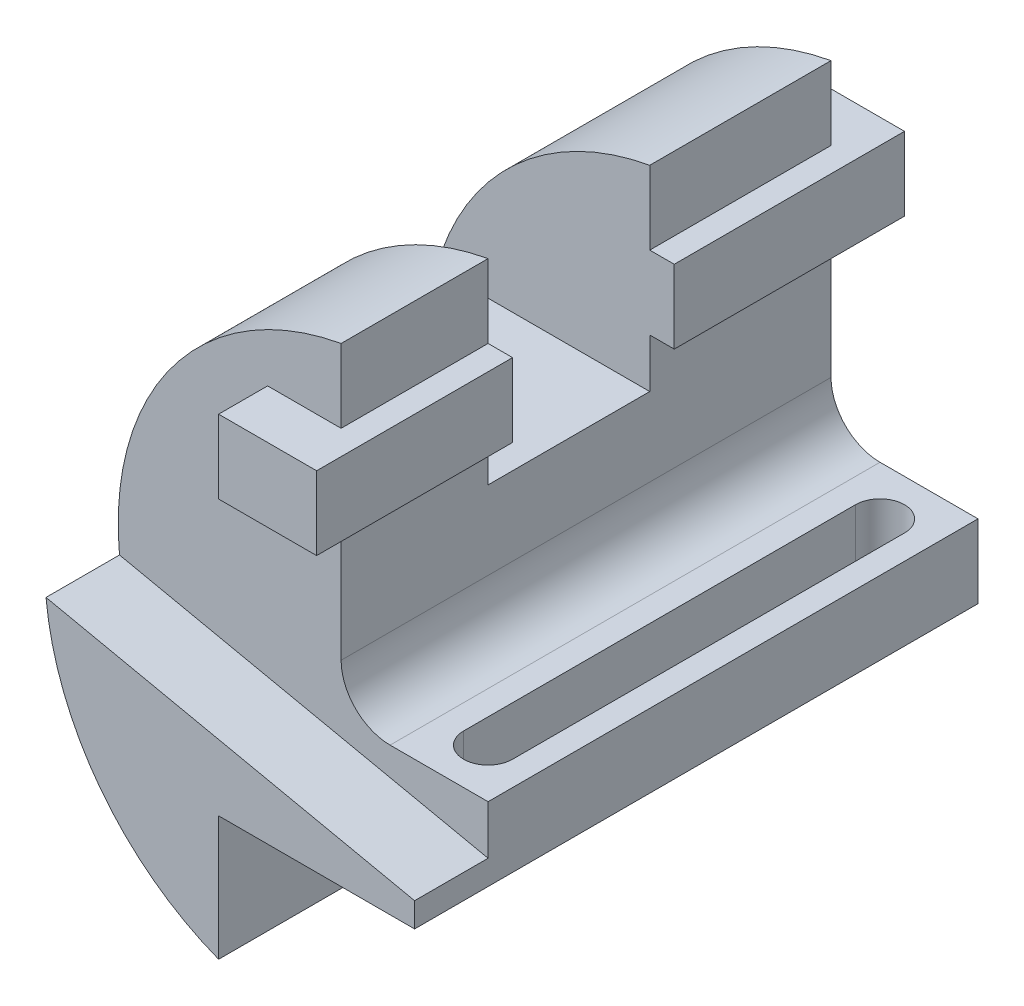
ISO-10303-21;
HEADER;
FILE_DESCRIPTION(('STEP AP214'),'2;1');
FILE_NAME('part.step','',(''),(''),'','','');
FILE_SCHEMA(('AUTOMOTIVE_DESIGN { 1 0 10303 214 1 1 1 1 }'));
ENDSEC;
DATA;
#1=APPLICATION_CONTEXT('core data for automotive mechanical design processes');
#2=APPLICATION_PROTOCOL_DEFINITION('international standard','automotive_design',2000,#1);
#3=PRODUCT_CONTEXT('',#1,'mechanical');
#4=PRODUCT('Part','Part','',(#3));
#5=PRODUCT_RELATED_PRODUCT_CATEGORY('part','',(#4));
#6=PRODUCT_DEFINITION_FORMATION('','',#4);
#7=PRODUCT_DEFINITION_CONTEXT('part definition',#1,'design');
#8=PRODUCT_DEFINITION('design','',#6,#7);
#9=PRODUCT_DEFINITION_SHAPE('','',#8);
#10=(LENGTH_UNIT() NAMED_UNIT(*) SI_UNIT(.MILLI.,.METRE.));
#11=(NAMED_UNIT(*) PLANE_ANGLE_UNIT() SI_UNIT($,.RADIAN.));
#12=(NAMED_UNIT(*) SI_UNIT($,.STERADIAN.) SOLID_ANGLE_UNIT());
#13=UNCERTAINTY_MEASURE_WITH_UNIT(LENGTH_MEASURE(1.E-05),#10,'distance_accuracy_value','');
#14=(GEOMETRIC_REPRESENTATION_CONTEXT(3) GLOBAL_UNCERTAINTY_ASSIGNED_CONTEXT((#13)) GLOBAL_UNIT_ASSIGNED_CONTEXT((#10,
#11,#12)) REPRESENTATION_CONTEXT('',''));
#15=CARTESIAN_POINT('',(0.,0.,0.));
#16=DIRECTION('',(0.,0.,1.));
#17=DIRECTION('',(1.,0.,0.));
#18=AXIS2_PLACEMENT_3D('',#15,#16,#17);
#19=CARTESIAN_POINT('',(-30.,15.,115.));
#20=DIRECTION('',(-1.,0.,0.));
#21=DIRECTION('',(0.,0.,1.));
#22=AXIS2_PLACEMENT_3D('',#19,#20,#21);
#23=PLANE('',#22);
#24=DIRECTION('',(0.,0.,1.));
#25=VECTOR('',#24,1.);
#26=CARTESIAN_POINT('',(-30.,66.,115.));
#27=LINE('',#26,#25);
#28=CARTESIAN_POINT('',(-30.,66.,70.));
#29=VERTEX_POINT('',#28);
#30=CARTESIAN_POINT('',(-30.,66.,100.));
#31=VERTEX_POINT('',#30);
#32=EDGE_CURVE('E370',#29,#31,#27,.T.);
#33=ORIENTED_EDGE('',*,*,#32,.F.);
#34=DIRECTION('',(0.,1.,0.));
#35=VECTOR('',#34,1.);
#36=CARTESIAN_POINT('',(-30.,15.,70.));
#37=LINE('',#36,#35);
#38=CARTESIAN_POINT('',(-30.0000000000001,81.,70.));
#39=VERTEX_POINT('',#38);
#40=EDGE_CURVE('E301',#29,#39,#37,.T.);
#41=ORIENTED_EDGE('',*,*,#40,.T.);
#42=DIRECTION('',(0.,0.,-1.));
#43=VECTOR('',#42,1.);
#44=CARTESIAN_POINT('',(-30.,81.,115.));
#45=LINE('',#44,#43);
#46=CARTESIAN_POINT('',(-30.,81.,100.));
#47=VERTEX_POINT('',#46);
#48=EDGE_CURVE('E465',#47,#39,#45,.T.);
#49=ORIENTED_EDGE('',*,*,#48,.F.);
#50=DIRECTION('',(0.,1.,0.));
#51=VECTOR('',#50,1.);
#52=CARTESIAN_POINT('',(-30.,15.,100.));
#53=LINE('',#52,#51);
#54=EDGE_CURVE('E399',#31,#47,#53,.T.);
#55=ORIENTED_EDGE('',*,*,#54,.F.);
#56=EDGE_LOOP('',(#33,#41,#49,#55));
#57=FACE_BOUND('',#56,.T.);
#58=ADVANCED_FACE('F47',(#57),#23,.F.);
#59=CARTESIAN_POINT('',(-25.,66.,-10.));
#60=DIRECTION('',(-1.,0.,0.));
#61=DIRECTION('',(0.,-1.,0.));
#62=AXIS2_PLACEMENT_3D('',#59,#60,#61);
#63=PLANE('',#62);
#64=DIRECTION('',(0.,0.,1.));
#65=VECTOR('',#64,1.);
#66=CARTESIAN_POINT('',(-25.,51.,-10.));
#67=LINE('',#66,#65);
#68=CARTESIAN_POINT('',(-25.,51.,70.));
#69=VERTEX_POINT('',#68);
#70=CARTESIAN_POINT('',(-25.,51.,110.));
#71=VERTEX_POINT('',#70);
#72=EDGE_CURVE('E365',#69,#71,#67,.T.);
#73=ORIENTED_EDGE('',*,*,#72,.F.);
#74=DIRECTION('',(0.,1.,0.));
#75=VECTOR('',#74,1.);
#76=CARTESIAN_POINT('',(-25.,66.,70.));
#77=LINE('',#76,#75);
#78=CARTESIAN_POINT('',(-25.,66.,70.));
#79=VERTEX_POINT('',#78);
#80=EDGE_CURVE('E297',#69,#79,#77,.T.);
#81=ORIENTED_EDGE('',*,*,#80,.T.);
#82=DIRECTION('',(0.,0.,1.));
#83=VECTOR('',#82,1.);
#84=CARTESIAN_POINT('',(-25.,66.,-10.));
#85=LINE('',#84,#83);
#86=CARTESIAN_POINT('',(-25.,66.,110.));
#87=VERTEX_POINT('',#86);
#88=EDGE_CURVE('E350',#79,#87,#85,.T.);
#89=ORIENTED_EDGE('',*,*,#88,.T.);
#90=DIRECTION('',(0.,1.,0.));
#91=VECTOR('',#90,1.);
#92=CARTESIAN_POINT('',(-25.,66.,110.));
#93=LINE('',#92,#91);
#94=EDGE_CURVE('E329',#71,#87,#93,.T.);
#95=ORIENTED_EDGE('',*,*,#94,.F.);
#96=EDGE_LOOP('',(#73,#81,#89,#95));
#97=FACE_BOUND('',#96,.T.);
#98=ADVANCED_FACE('F530',(#97),#63,.F.);
#99=CARTESIAN_POINT('',(-25.,51.,-10.));
#100=DIRECTION('',(0.,1.,0.));
#101=DIRECTION('',(0.,0.,1.));
#102=AXIS2_PLACEMENT_3D('',#99,#100,#101);
#103=PLANE('',#102);
#104=DIRECTION('',(0.,0.,-1.));
#105=VECTOR('',#104,1.);
#106=CARTESIAN_POINT('',(-30.,51.,115.));
#107=LINE('',#106,#105);
#108=CARTESIAN_POINT('',(-30.,51.,100.));
#109=VERTEX_POINT('',#108);
#110=CARTESIAN_POINT('',(-30.,51.,70.));
#111=VERTEX_POINT('',#110);
#112=EDGE_CURVE('E384',#109,#111,#107,.T.);
#113=ORIENTED_EDGE('',*,*,#112,.T.);
#114=DIRECTION('',(1.,0.,0.));
#115=VECTOR('',#114,1.);
#116=CARTESIAN_POINT('',(-25.,51.,70.));
#117=LINE('',#116,#115);
#118=EDGE_CURVE('E305',#111,#69,#117,.T.);
#119=ORIENTED_EDGE('',*,*,#118,.T.);
#120=ORIENTED_EDGE('',*,*,#72,.T.);
#121=DIRECTION('',(1.,0.,0.));
#122=VECTOR('',#121,1.);
#123=CARTESIAN_POINT('',(-25.,51.,110.));
#124=LINE('',#123,#122);
#125=CARTESIAN_POINT('',(-45.,51.,110.));
#126=VERTEX_POINT('',#125);
#127=EDGE_CURVE('E333',#126,#71,#124,.T.);
#128=ORIENTED_EDGE('',*,*,#127,.F.);
#129=DIRECTION('',(0.,0.,1.));
#130=VECTOR('',#129,1.);
#131=CARTESIAN_POINT('',(-45.,51.,-10.));
#132=LINE('',#131,#130);
#133=CARTESIAN_POINT('',(-45.,51.,100.));
#134=VERTEX_POINT('',#133);
#135=EDGE_CURVE('E360',#134,#126,#132,.T.);
#136=ORIENTED_EDGE('',*,*,#135,.F.);
#137=DIRECTION('',(-1.,0.,0.));
#138=VECTOR('',#137,1.);
#139=CARTESIAN_POINT('',(-20.,51.,100.));
#140=LINE('',#139,#138);
#141=EDGE_CURVE('E480',#109,#134,#140,.T.);
#142=ORIENTED_EDGE('',*,*,#141,.F.);
#143=EDGE_LOOP('',(#113,#119,#120,#128,#136,#142));
#144=FACE_BOUND('',#143,.T.);
#145=ADVANCED_FACE('F549',(#144),#103,.F.);
#146=CARTESIAN_POINT('',(-25.,66.,-10.));
#147=DIRECTION('',(0.,-1.,0.));
#148=DIRECTION('',(0.,0.,-1.));
#149=AXIS2_PLACEMENT_3D('',#146,#147,#148);
#150=PLANE('',#149);
#151=ORIENTED_EDGE('',*,*,#88,.F.);
#152=DIRECTION('',(-1.,0.,0.));
#153=VECTOR('',#152,1.);
#154=CARTESIAN_POINT('',(-25.,66.,70.));
#155=LINE('',#154,#153);
#156=EDGE_CURVE('E488',#79,#29,#155,.T.);
#157=ORIENTED_EDGE('',*,*,#156,.T.);
#158=ORIENTED_EDGE('',*,*,#32,.T.);
#159=DIRECTION('',(1.,0.,0.));
#160=VECTOR('',#159,1.);
#161=CARTESIAN_POINT('',(-20.,66.,100.));
#162=LINE('',#161,#160);
#163=CARTESIAN_POINT('',(-45.,66.,100.));
#164=VERTEX_POINT('',#163);
#165=EDGE_CURVE('E472',#164,#31,#162,.T.);
#166=ORIENTED_EDGE('',*,*,#165,.F.);
#167=DIRECTION('',(0.,0.,1.));
#168=VECTOR('',#167,1.);
#169=CARTESIAN_POINT('',(-45.,66.,-10.));
#170=LINE('',#169,#168);
#171=CARTESIAN_POINT('',(-45.,66.,110.));
#172=VERTEX_POINT('',#171);
#173=EDGE_CURVE('E355',#164,#172,#170,.T.);
#174=ORIENTED_EDGE('',*,*,#173,.T.);
#175=DIRECTION('',(-1.,0.,0.));
#176=VECTOR('',#175,1.);
#177=CARTESIAN_POINT('',(-25.,66.,110.));
#178=LINE('',#177,#176);
#179=EDGE_CURVE('E325',#87,#172,#178,.T.);
#180=ORIENTED_EDGE('',*,*,#179,.F.);
#181=EDGE_LOOP('',(#151,#157,#158,#166,#174,#180));
#182=FACE_BOUND('',#181,.T.);
#183=ADVANCED_FACE('F537',(#182),#150,.F.);
#184=CARTESIAN_POINT('',(-30.,25.,100.));
#185=VERTEX_POINT('',#184);
#186=EDGE_CURVE('E400',#185,#109,#53,.T.);
#187=ORIENTED_EDGE('',*,*,#186,.F.);
#188=DIRECTION('',(0.,0.,-1.));
#189=VECTOR('',#188,1.);
#190=CARTESIAN_POINT('',(-30.,25.,0.));
#191=LINE('',#190,#189);
#192=CARTESIAN_POINT('',(-30.,25.,0.));
#193=VERTEX_POINT('',#192);
#194=EDGE_CURVE('E509',#185,#193,#191,.T.);
#195=ORIENTED_EDGE('',*,*,#194,.T.);
#196=DIRECTION('',(0.,1.,0.));
#197=VECTOR('',#196,1.);
#198=CARTESIAN_POINT('',(-30.,15.,0.));
#199=LINE('',#198,#197);
#200=CARTESIAN_POINT('',(-30.,51.,0.));
#201=VERTEX_POINT('',#200);
#202=EDGE_CURVE('E442',#193,#201,#199,.T.);
#203=ORIENTED_EDGE('',*,*,#202,.T.);
#204=CARTESIAN_POINT('',(-30.,51.,37.));
#205=VERTEX_POINT('',#204);
#206=EDGE_CURVE('E383',#205,#201,#107,.T.);
#207=ORIENTED_EDGE('',*,*,#206,.F.);
#208=DIRECTION('',(0.,-1.,0.));
#209=VECTOR('',#208,1.);
#210=CARTESIAN_POINT('',(-30.,15.,37.));
#211=LINE('',#210,#209);
#212=CARTESIAN_POINT('',(-30.,41.,37.));
#213=VERTEX_POINT('',#212);
#214=EDGE_CURVE('E293',#205,#213,#211,.T.);
#215=ORIENTED_EDGE('',*,*,#214,.T.);
#216=DIRECTION('',(0.,0.,1.));
#217=VECTOR('',#216,1.);
#218=CARTESIAN_POINT('',(-30.,41.,115.));
#219=LINE('',#218,#217);
#220=CARTESIAN_POINT('',(-30.,41.,70.));
#221=VERTEX_POINT('',#220);
#222=EDGE_CURVE('E317',#213,#221,#219,.T.);
#223=ORIENTED_EDGE('',*,*,#222,.T.);
#224=DIRECTION('',(0.,1.,0.));
#225=VECTOR('',#224,1.);
#226=CARTESIAN_POINT('',(-30.,15.,70.));
#227=LINE('',#226,#225);
#228=EDGE_CURVE('E313',#221,#111,#227,.T.);
#229=ORIENTED_EDGE('',*,*,#228,.T.);
#230=ORIENTED_EDGE('',*,*,#112,.F.);
#231=EDGE_LOOP('',(#187,#195,#203,#207,#215,#223,#229,#230));
#232=FACE_BOUND('',#231,.T.);
#233=ADVANCED_FACE('F551',(#232),#23,.F.);
#234=CARTESIAN_POINT('',(-30.0000000000001,81.,37.));
#235=VERTEX_POINT('',#234);
#236=CARTESIAN_POINT('',(-30.,81.,0.));
#237=VERTEX_POINT('',#236);
#238=EDGE_CURVE('E464',#235,#237,#45,.T.);
#239=ORIENTED_EDGE('',*,*,#238,.F.);
#240=DIRECTION('',(0.,-1.,0.));
#241=VECTOR('',#240,1.);
#242=CARTESIAN_POINT('',(-30.,15.,37.));
#243=LINE('',#242,#241);
#244=CARTESIAN_POINT('',(-30.,66.,37.));
#245=VERTEX_POINT('',#244);
#246=EDGE_CURVE('E281',#235,#245,#243,.T.);
#247=ORIENTED_EDGE('',*,*,#246,.T.);
#248=CARTESIAN_POINT('',(-30.,66.,0.));
#249=VERTEX_POINT('',#248);
#250=EDGE_CURVE('E371',#249,#245,#27,.T.);
#251=ORIENTED_EDGE('',*,*,#250,.F.);
#252=EDGE_CURVE('E441',#249,#237,#199,.T.);
#253=ORIENTED_EDGE('',*,*,#252,.T.);
#254=EDGE_LOOP('',(#239,#247,#251,#253));
#255=FACE_BOUND('',#254,.T.);
#256=ADVANCED_FACE('F611',(#255),#23,.F.);
#257=CARTESIAN_POINT('',(-20.,26.4083339693685,0.));
#258=DIRECTION('',(0.,0.,-1.));
#259=DIRECTION('',(-1.,0.,0.));
#260=AXIS2_PLACEMENT_3D('',#257,#258,#259);
#261=PLANE('',#260);
#262=DIRECTION('',(0.,-1.,0.));
#263=VECTOR('',#262,1.);
#264=CARTESIAN_POINT('',(-45.,26.4083339693685,0.));
#265=LINE('',#264,#263);
#266=CARTESIAN_POINT('',(-45.,66.,0.));
#267=VERTEX_POINT('',#266);
#268=CARTESIAN_POINT('',(-45.,51.,0.));
#269=VERTEX_POINT('',#268);
#270=EDGE_CURVE('E379',#267,#269,#265,.T.);
#271=ORIENTED_EDGE('',*,*,#270,.T.);
#272=DIRECTION('',(1.,0.,0.));
#273=VECTOR('',#272,1.);
#274=CARTESIAN_POINT('',(-20.,51.,0.));
#275=LINE('',#274,#273);
#276=EDGE_CURVE('E388',#269,#201,#275,.T.);
#277=ORIENTED_EDGE('',*,*,#276,.T.);
#278=ORIENTED_EDGE('',*,*,#202,.F.);
#279=CARTESIAN_POINT('',(-20.,25.,0.));
#280=DIRECTION('',(0.,0.,-1.));
#281=DIRECTION('',(-1.,0.,0.));
#282=AXIS2_PLACEMENT_3D('',#279,#280,#281);
#283=CIRCLE('',#282,10.);
#284=CARTESIAN_POINT('',(-20.,15.,0.));
#285=VERTEX_POINT('',#284);
#286=EDGE_CURVE('E56',#193,#285,#283,.F.);
#287=ORIENTED_EDGE('',*,*,#286,.T.);
#288=DIRECTION('',(-1.,0.,0.));
#289=VECTOR('',#288,1.);
#290=CARTESIAN_POINT('',(0.,15.,0.));
#291=LINE('',#290,#289);
#292=CARTESIAN_POINT('',(0.,15.,0.));
#293=VERTEX_POINT('',#292);
#294=EDGE_CURVE('E438',#293,#285,#291,.T.);
#295=ORIENTED_EDGE('',*,*,#294,.F.);
#296=DIRECTION('',(0.,1.,0.));
#297=VECTOR('',#296,1.);
#298=CARTESIAN_POINT('',(0.,0.,0.));
#299=LINE('',#298,#297);
#300=CARTESIAN_POINT('',(0.,0.,0.));
#301=VERTEX_POINT('',#300);
#302=EDGE_CURVE('E417',#301,#293,#299,.T.);
#303=ORIENTED_EDGE('',*,*,#302,.F.);
#304=DIRECTION('',(1.,0.,0.));
#305=VECTOR('',#304,1.);
#306=CARTESIAN_POINT('',(0.,0.,0.));
#307=LINE('',#306,#305);
#308=CARTESIAN_POINT('',(-40.,0.,0.));
#309=VERTEX_POINT('',#308);
#310=EDGE_CURVE('E425',#309,#301,#307,.T.);
#311=ORIENTED_EDGE('',*,*,#310,.F.);
#312=DIRECTION('',(0.,1.,0.));
#313=VECTOR('',#312,1.);
#314=CARTESIAN_POINT('',(-40.,0.,0.));
#315=LINE('',#314,#313);
#316=CARTESIAN_POINT('',(-40.,-25.3627969821569,0.));
#317=VERTEX_POINT('',#316);
#318=EDGE_CURVE('E448',#317,#309,#315,.T.);
#319=ORIENTED_EDGE('',*,*,#318,.F.);
#320=CARTESIAN_POINT('',(-20.,26.4083339693685,0.));
#321=DIRECTION('',(0.,0.,1.));
#322=DIRECTION('',(-1.,0.,0.));
#323=AXIS2_PLACEMENT_3D('',#320,#321,#322);
#324=CIRCLE('',#323,55.5);
#325=EDGE_CURVE('E445',#237,#317,#324,.T.);
#326=ORIENTED_EDGE('',*,*,#325,.F.);
#327=ORIENTED_EDGE('',*,*,#252,.F.);
#328=DIRECTION('',(-1.,0.,0.));
#329=VECTOR('',#328,1.);
#330=CARTESIAN_POINT('',(-20.,66.,0.));
#331=LINE('',#330,#329);
#332=EDGE_CURVE('E375',#249,#267,#331,.T.);
#333=ORIENTED_EDGE('',*,*,#332,.T.);
#334=EDGE_LOOP('',(#271,#277,#278,#287,#295,#303,#311,#319,#326,#327,#333));
#335=FACE_BOUND('',#334,.T.);
#336=ADVANCED_FACE('F585',(#335),#261,.T.);
#337=CARTESIAN_POINT('',(-20.,26.4083339693685,100.));
#338=DIRECTION('',(0.,0.,1.));
#339=DIRECTION('',(1.,0.,0.));
#340=AXIS2_PLACEMENT_3D('',#337,#338,#339);
#341=PLANE('',#340);
#342=DIRECTION('',(-1.,0.,0.));
#343=VECTOR('',#342,1.);
#344=CARTESIAN_POINT('',(0.,15.,100.));
#345=LINE('',#344,#343);
#346=CARTESIAN_POINT('',(0.,15.,100.));
#347=VERTEX_POINT('',#346);
#348=CARTESIAN_POINT('',(-20.,15.,100.));
#349=VERTEX_POINT('',#348);
#350=EDGE_CURVE('E396',#347,#349,#345,.T.);
#351=ORIENTED_EDGE('',*,*,#350,.T.);
#352=CARTESIAN_POINT('',(-20.,25.,100.));
#353=DIRECTION('',(0.,0.,1.));
#354=DIRECTION('',(1.,0.,0.));
#355=AXIS2_PLACEMENT_3D('',#352,#353,#354);
#356=CIRCLE('',#355,10.);
#357=EDGE_CURVE('E12',#349,#185,#356,.F.);
#358=ORIENTED_EDGE('',*,*,#357,.T.);
#359=ORIENTED_EDGE('',*,*,#186,.T.);
#360=ORIENTED_EDGE('',*,*,#141,.T.);
#361=DIRECTION('',(0.,1.,0.));
#362=VECTOR('',#361,1.);
#363=CARTESIAN_POINT('',(-45.,26.4083339693685,100.));
#364=LINE('',#363,#362);
#365=EDGE_CURVE('E476',#134,#164,#364,.T.);
#366=ORIENTED_EDGE('',*,*,#365,.T.);
#367=ORIENTED_EDGE('',*,*,#165,.T.);
#368=ORIENTED_EDGE('',*,*,#54,.T.);
#369=CARTESIAN_POINT('',(-20.,26.4083339693685,100.));
#370=DIRECTION('',(0.,0.,1.));
#371=DIRECTION('',(1.,0.,0.));
#372=AXIS2_PLACEMENT_3D('',#369,#370,#371);
#373=CIRCLE('',#372,55.5);
#374=CARTESIAN_POINT('',(-75.2350441418964,20.9917022998936,100.));
#375=VERTEX_POINT('',#374);
#376=EDGE_CURVE('E403',#47,#375,#373,.T.);
#377=ORIENTED_EDGE('',*,*,#376,.T.);
#378=DIRECTION('',(0.978147600733806,-0.207911690817756,0.));
#379=VECTOR('',#378,1.);
#380=CARTESIAN_POINT('',(0.,5.,100.));
#381=LINE('',#380,#379);
#382=CARTESIAN_POINT('',(0.,5.,100.));
#383=VERTEX_POINT('',#382);
#384=EDGE_CURVE('E406',#375,#383,#381,.T.);
#385=ORIENTED_EDGE('',*,*,#384,.T.);
#386=DIRECTION('',(0.,1.,0.));
#387=VECTOR('',#386,1.);
#388=CARTESIAN_POINT('',(0.,5.,100.));
#389=LINE('',#388,#387);
#390=EDGE_CURVE('E393',#383,#347,#389,.T.);
#391=ORIENTED_EDGE('',*,*,#390,.T.);
#392=EDGE_LOOP('',(#351,#358,#359,#360,#366,#367,#368,#377,#385,#391));
#393=FACE_BOUND('',#392,.T.);
#394=ADVANCED_FACE('F543',(#393),#341,.T.);
#395=CARTESIAN_POINT('',(0.,15.,115.));
#396=DIRECTION('',(0.,-1.,0.));
#397=DIRECTION('',(1.,0.,0.));
#398=AXIS2_PLACEMENT_3D('',#395,#396,#397);
#399=PLANE('',#398);
#400=DIRECTION('',(0.,0.,-1.));
#401=VECTOR('',#400,1.);
#402=CARTESIAN_POINT('',(-15.,15.,115.));
#403=LINE('',#402,#401);
#404=CARTESIAN_POINT('',(-15.,15.,90.));
#405=VERTEX_POINT('',#404);
#406=CARTESIAN_POINT('',(-15.,15.,10.));
#407=VERTEX_POINT('',#406);
#408=EDGE_CURVE('E232',#405,#407,#403,.T.);
#409=ORIENTED_EDGE('',*,*,#408,.T.);
#410=CARTESIAN_POINT('',(-9.99999999999999,15.,10.));
#411=DIRECTION('',(0.,-1.,0.));
#412=DIRECTION('',(1.,0.,0.));
#413=AXIS2_PLACEMENT_3D('',#410,#411,#412);
#414=CIRCLE('',#413,5.);
#415=CARTESIAN_POINT('',(-4.99999999999999,15.,10.));
#416=VERTEX_POINT('',#415);
#417=EDGE_CURVE('E263',#407,#416,#414,.T.);
#418=ORIENTED_EDGE('',*,*,#417,.T.);
#419=DIRECTION('',(0.,0.,1.));
#420=VECTOR('',#419,1.);
#421=CARTESIAN_POINT('',(-5.,15.,115.));
#422=LINE('',#421,#420);
#423=CARTESIAN_POINT('',(-5.,15.,90.));
#424=VERTEX_POINT('',#423);
#425=EDGE_CURVE('E259',#416,#424,#422,.T.);
#426=ORIENTED_EDGE('',*,*,#425,.T.);
#427=CARTESIAN_POINT('',(-10.,15.,90.));
#428=DIRECTION('',(0.,-1.,0.));
#429=DIRECTION('',(1.,0.,0.));
#430=AXIS2_PLACEMENT_3D('',#427,#428,#429);
#431=CIRCLE('',#430,5.);
#432=EDGE_CURVE('E244',#424,#405,#431,.T.);
#433=ORIENTED_EDGE('',*,*,#432,.T.);
#434=EDGE_LOOP('',(#409,#418,#426,#433));
#435=FACE_BOUND('',#434,.T.);
#436=ORIENTED_EDGE('',*,*,#294,.T.);
#437=DIRECTION('',(0.,0.,-1.));
#438=VECTOR('',#437,1.);
#439=CARTESIAN_POINT('',(-20.,15.,100.));
#440=LINE('',#439,#438);
#441=EDGE_CURVE('E69',#285,#349,#440,.F.);
#442=ORIENTED_EDGE('',*,*,#441,.T.);
#443=ORIENTED_EDGE('',*,*,#350,.F.);
#444=DIRECTION('',(0.,0.,-1.));
#445=VECTOR('',#444,1.);
#446=CARTESIAN_POINT('',(0.,15.,115.));
#447=LINE('',#446,#445);
#448=EDGE_CURVE('E469',#347,#293,#447,.T.);
#449=ORIENTED_EDGE('',*,*,#448,.T.);
#450=EDGE_LOOP('',(#436,#442,#443,#449));
#451=FACE_BOUND('',#450,.T.);
#452=ADVANCED_FACE('F258',(#435,#451),#399,.F.);
#453=CARTESIAN_POINT('',(0.,0.,115.));
#454=DIRECTION('',(-1.,0.,0.));
#455=DIRECTION('',(0.,0.,1.));
#456=AXIS2_PLACEMENT_3D('',#453,#454,#455);
#457=PLANE('',#456);
#458=ORIENTED_EDGE('',*,*,#390,.F.);
#459=DIRECTION('',(0.,0.,1.));
#460=VECTOR('',#459,1.);
#461=CARTESIAN_POINT('',(0.,5.,100.));
#462=LINE('',#461,#460);
#463=CARTESIAN_POINT('',(0.,5.,115.));
#464=VERTEX_POINT('',#463);
#465=EDGE_CURVE('E413',#383,#464,#462,.T.);
#466=ORIENTED_EDGE('',*,*,#465,.T.);
#467=DIRECTION('',(0.,1.,0.));
#468=VECTOR('',#467,1.);
#469=CARTESIAN_POINT('',(0.,0.,115.));
#470=LINE('',#469,#468);
#471=CARTESIAN_POINT('',(0.,0.,115.));
#472=VERTEX_POINT('',#471);
#473=EDGE_CURVE('E420',#472,#464,#470,.T.);
#474=ORIENTED_EDGE('',*,*,#473,.F.);
#475=DIRECTION('',(0.,0.,-1.));
#476=VECTOR('',#475,1.);
#477=CARTESIAN_POINT('',(0.,0.,115.));
#478=LINE('',#477,#476);
#479=EDGE_CURVE('E434',#472,#301,#478,.T.);
#480=ORIENTED_EDGE('',*,*,#479,.T.);
#481=ORIENTED_EDGE('',*,*,#302,.T.);
#482=ORIENTED_EDGE('',*,*,#448,.F.);
#483=EDGE_LOOP('',(#458,#466,#474,#480,#481,#482));
#484=FACE_BOUND('',#483,.T.);
#485=ADVANCED_FACE('F580',(#484),#457,.F.);
#486=CARTESIAN_POINT('',(-20.,26.4083339693685,115.));
#487=DIRECTION('',(0.,0.,-1.));
#488=DIRECTION('',(-1.,0.,0.));
#489=AXIS2_PLACEMENT_3D('',#486,#487,#488);
#490=CYLINDRICAL_SURFACE('',#489,55.5);
#491=ORIENTED_EDGE('',*,*,#48,.T.);
#492=CARTESIAN_POINT('',(-20.,26.4083339693685,70.));
#493=DIRECTION('',(0.,0.,1.));
#494=DIRECTION('',(1.,0.,0.));
#495=AXIS2_PLACEMENT_3D('',#492,#493,#494);
#496=CIRCLE('',#495,55.5);
#497=CARTESIAN_POINT('',(-73.5474862383895,41.,70.));
#498=VERTEX_POINT('',#497);
#499=EDGE_CURVE('E309',#39,#498,#496,.T.);
#500=ORIENTED_EDGE('',*,*,#499,.T.);
#501=DIRECTION('',(0.,0.,-1.));
#502=VECTOR('',#501,1.);
#503=CARTESIAN_POINT('',(-73.5474862383895,41.,115.));
#504=LINE('',#503,#502);
#505=CARTESIAN_POINT('',(-73.5474862383895,41.,37.));
#506=VERTEX_POINT('',#505);
#507=EDGE_CURVE('E492',#498,#506,#504,.T.);
#508=ORIENTED_EDGE('',*,*,#507,.T.);
#509=CARTESIAN_POINT('',(-20.,26.4083339693685,37.));
#510=DIRECTION('',(0.,0.,-1.));
#511=DIRECTION('',(0.,1.,0.));
#512=AXIS2_PLACEMENT_3D('',#509,#510,#511);
#513=CIRCLE('',#512,55.5);
#514=EDGE_CURVE('E289',#506,#235,#513,.T.);
#515=ORIENTED_EDGE('',*,*,#514,.T.);
#516=ORIENTED_EDGE('',*,*,#238,.T.);
#517=ORIENTED_EDGE('',*,*,#325,.T.);
#518=DIRECTION('',(0.,0.,-1.));
#519=VECTOR('',#518,1.);
#520=CARTESIAN_POINT('',(-40.,-25.3627969821569,115.));
#521=LINE('',#520,#519);
#522=CARTESIAN_POINT('',(-40.,-25.3627969821569,115.));
#523=VERTEX_POINT('',#522);
#524=EDGE_CURVE('E460',#523,#317,#521,.T.);
#525=ORIENTED_EDGE('',*,*,#524,.F.);
#526=CARTESIAN_POINT('',(-20.,26.4083339693685,115.));
#527=DIRECTION('',(0.,0.,1.));
#528=DIRECTION('',(-1.,0.,0.));
#529=AXIS2_PLACEMENT_3D('',#526,#527,#528);
#530=CIRCLE('',#529,55.5);
#531=CARTESIAN_POINT('',(-75.2350441418964,20.9917022998936,115.));
#532=VERTEX_POINT('',#531);
#533=EDGE_CURVE('E424',#532,#523,#530,.T.);
#534=ORIENTED_EDGE('',*,*,#533,.F.);
#535=DIRECTION('',(0.,0.,1.));
#536=VECTOR('',#535,1.);
#537=CARTESIAN_POINT('',(-75.2350441418964,20.9917022998936,100.));
#538=LINE('',#537,#536);
#539=EDGE_CURVE('E410',#375,#532,#538,.T.);
#540=ORIENTED_EDGE('',*,*,#539,.F.);
#541=ORIENTED_EDGE('',*,*,#376,.F.);
#542=EDGE_LOOP('',(#491,#500,#508,#515,#516,#517,#525,#534,#540,#541));
#543=FACE_BOUND('',#542,.T.);
#544=ADVANCED_FACE('F560',(#543),#490,.T.);
#545=CARTESIAN_POINT('',(-40.,0.,115.));
#546=DIRECTION('',(-1.,0.,0.));
#547=DIRECTION('',(0.,-1.,0.));
#548=AXIS2_PLACEMENT_3D('',#545,#546,#547);
#549=PLANE('',#548);
#550=ORIENTED_EDGE('',*,*,#318,.T.);
#551=DIRECTION('',(0.,0.,-1.));
#552=VECTOR('',#551,1.);
#553=CARTESIAN_POINT('',(-40.,0.,115.));
#554=LINE('',#553,#552);
#555=CARTESIAN_POINT('',(-40.,0.,115.));
#556=VERTEX_POINT('',#555);
#557=EDGE_CURVE('E456',#556,#309,#554,.T.);
#558=ORIENTED_EDGE('',*,*,#557,.F.);
#559=DIRECTION('',(0.,1.,0.));
#560=VECTOR('',#559,1.);
#561=CARTESIAN_POINT('',(-40.,0.,115.));
#562=LINE('',#561,#560);
#563=EDGE_CURVE('E428',#523,#556,#562,.T.);
#564=ORIENTED_EDGE('',*,*,#563,.F.);
#565=ORIENTED_EDGE('',*,*,#524,.T.);
#566=EDGE_LOOP('',(#550,#558,#564,#565));
#567=FACE_BOUND('',#566,.T.);
#568=ADVANCED_FACE('F615',(#567),#549,.F.);
#569=CARTESIAN_POINT('',(0.,0.,115.));
#570=DIRECTION('',(0.,1.,0.));
#571=DIRECTION('',(0.,0.,1.));
#572=AXIS2_PLACEMENT_3D('',#569,#570,#571);
#573=PLANE('',#572);
#574=DIRECTION('',(0.,0.,-1.));
#575=VECTOR('',#574,1.);
#576=CARTESIAN_POINT('',(-5.,0.,115.));
#577=LINE('',#576,#575);
#578=CARTESIAN_POINT('',(-5.,0.,90.));
#579=VERTEX_POINT('',#578);
#580=CARTESIAN_POINT('',(-4.99999999999999,0.,10.));
#581=VERTEX_POINT('',#580);
#582=EDGE_CURVE('E501',#579,#581,#577,.T.);
#583=ORIENTED_EDGE('',*,*,#582,.T.);
#584=CARTESIAN_POINT('',(-9.99999999999999,0.,10.));
#585=DIRECTION('',(0.,1.,0.));
#586=DIRECTION('',(0.,0.,1.));
#587=AXIS2_PLACEMENT_3D('',#584,#585,#586);
#588=CIRCLE('',#587,5.);
#589=CARTESIAN_POINT('',(-15.,0.,10.));
#590=VERTEX_POINT('',#589);
#591=EDGE_CURVE('E505',#581,#590,#588,.T.);
#592=ORIENTED_EDGE('',*,*,#591,.T.);
#593=DIRECTION('',(0.,0.,1.));
#594=VECTOR('',#593,1.);
#595=CARTESIAN_POINT('',(-15.,0.,115.));
#596=LINE('',#595,#594);
#597=CARTESIAN_POINT('',(-15.,0.,90.));
#598=VERTEX_POINT('',#597);
#599=EDGE_CURVE('E496',#590,#598,#596,.T.);
#600=ORIENTED_EDGE('',*,*,#599,.T.);
#601=CARTESIAN_POINT('',(-10.,0.,90.));
#602=DIRECTION('',(0.,1.,0.));
#603=DIRECTION('',(0.,0.,1.));
#604=AXIS2_PLACEMENT_3D('',#601,#602,#603);
#605=CIRCLE('',#604,5.);
#606=EDGE_CURVE('E252',#598,#579,#605,.T.);
#607=ORIENTED_EDGE('',*,*,#606,.T.);
#608=EDGE_LOOP('',(#583,#592,#600,#607));
#609=FACE_BOUND('',#608,.T.);
#610=ORIENTED_EDGE('',*,*,#310,.T.);
#611=ORIENTED_EDGE('',*,*,#479,.F.);
#612=DIRECTION('',(1.,0.,0.));
#613=VECTOR('',#612,1.);
#614=CARTESIAN_POINT('',(0.,0.,115.));
#615=LINE('',#614,#613);
#616=EDGE_CURVE('E431',#556,#472,#615,.T.);
#617=ORIENTED_EDGE('',*,*,#616,.F.);
#618=ORIENTED_EDGE('',*,*,#557,.T.);
#619=EDGE_LOOP('',(#610,#611,#617,#618));
#620=FACE_BOUND('',#619,.T.);
#621=ADVANCED_FACE('F618',(#609,#620),#573,.F.);
#622=CARTESIAN_POINT('',(-20.,26.4083339693685,115.));
#623=DIRECTION('',(0.,0.,-1.));
#624=DIRECTION('',(-1.,0.,0.));
#625=AXIS2_PLACEMENT_3D('',#622,#623,#624);
#626=PLANE('',#625);
#627=ORIENTED_EDGE('',*,*,#473,.T.);
#628=DIRECTION('',(0.978147600733806,-0.207911690817756,0.));
#629=VECTOR('',#628,1.);
#630=CARTESIAN_POINT('',(0.,5.,115.));
#631=LINE('',#630,#629);
#632=EDGE_CURVE('E392',#532,#464,#631,.T.);
#633=ORIENTED_EDGE('',*,*,#632,.F.);
#634=ORIENTED_EDGE('',*,*,#533,.T.);
#635=ORIENTED_EDGE('',*,*,#563,.T.);
#636=ORIENTED_EDGE('',*,*,#616,.T.);
#637=EDGE_LOOP('',(#627,#633,#634,#635,#636));
#638=FACE_BOUND('',#637,.T.);
#639=ADVANCED_FACE('F574',(#638),#626,.F.);
#640=CARTESIAN_POINT('',(0.,5.,100.));
#641=DIRECTION('',(-0.207911690817756,-0.978147600733806,0.));
#642=DIRECTION('',(0.978147600733806,-0.207911690817756,0.));
#643=AXIS2_PLACEMENT_3D('',#640,#641,#642);
#644=PLANE('',#643);
#645=ORIENTED_EDGE('',*,*,#632,.T.);
#646=ORIENTED_EDGE('',*,*,#465,.F.);
#647=ORIENTED_EDGE('',*,*,#384,.F.);
#648=ORIENTED_EDGE('',*,*,#539,.T.);
#649=EDGE_LOOP('',(#645,#646,#647,#648));
#650=FACE_BOUND('',#649,.T.);
#651=ADVANCED_FACE('F572',(#650),#644,.F.);
#652=CARTESIAN_POINT('',(-45.,66.,-10.));
#653=DIRECTION('',(1.,0.,0.));
#654=DIRECTION('',(0.,0.,-1.));
#655=AXIS2_PLACEMENT_3D('',#652,#653,#654);
#656=PLANE('',#655);
#657=ORIENTED_EDGE('',*,*,#270,.F.);
#658=CARTESIAN_POINT('',(-45.,66.,-10.));
#659=VERTEX_POINT('',#658);
#660=EDGE_CURVE('E356',#659,#267,#170,.T.);
#661=ORIENTED_EDGE('',*,*,#660,.F.);
#662=DIRECTION('',(0.,1.,0.));
#663=VECTOR('',#662,1.);
#664=CARTESIAN_POINT('',(-45.,66.,-10.));
#665=LINE('',#664,#663);
#666=CARTESIAN_POINT('',(-45.,51.,-10.));
#667=VERTEX_POINT('',#666);
#668=EDGE_CURVE('E344',#667,#659,#665,.T.);
#669=ORIENTED_EDGE('',*,*,#668,.F.);
#670=EDGE_CURVE('E361',#667,#269,#132,.T.);
#671=ORIENTED_EDGE('',*,*,#670,.T.);
#672=EDGE_LOOP('',(#657,#661,#669,#671));
#673=FACE_BOUND('',#672,.T.);
#674=ADVANCED_FACE('F594',(#673),#656,.F.);
#675=CARTESIAN_POINT('',(-25.,66.,-10.));
#676=VERTEX_POINT('',#675);
#677=CARTESIAN_POINT('',(-25.,66.,37.));
#678=VERTEX_POINT('',#677);
#679=EDGE_CURVE('E351',#676,#678,#85,.T.);
#680=ORIENTED_EDGE('',*,*,#679,.T.);
#681=DIRECTION('',(0.,-1.,0.));
#682=VECTOR('',#681,1.);
#683=CARTESIAN_POINT('',(-25.,66.,37.));
#684=LINE('',#683,#682);
#685=CARTESIAN_POINT('',(-25.,51.,37.));
#686=VERTEX_POINT('',#685);
#687=EDGE_CURVE('E274',#678,#686,#684,.T.);
#688=ORIENTED_EDGE('',*,*,#687,.T.);
#689=CARTESIAN_POINT('',(-25.,51.,-10.));
#690=VERTEX_POINT('',#689);
#691=EDGE_CURVE('E366',#690,#686,#67,.T.);
#692=ORIENTED_EDGE('',*,*,#691,.F.);
#693=DIRECTION('',(0.,-1.,0.));
#694=VECTOR('',#693,1.);
#695=CARTESIAN_POINT('',(-25.,66.,-10.));
#696=LINE('',#695,#694);
#697=EDGE_CURVE('E337',#676,#690,#696,.T.);
#698=ORIENTED_EDGE('',*,*,#697,.F.);
#699=EDGE_LOOP('',(#680,#688,#692,#698));
#700=FACE_BOUND('',#699,.T.);
#701=ADVANCED_FACE('F603',(#700),#63,.F.);
#702=ORIENTED_EDGE('',*,*,#691,.T.);
#703=DIRECTION('',(-1.,0.,0.));
#704=VECTOR('',#703,1.);
#705=CARTESIAN_POINT('',(-25.,51.,37.));
#706=LINE('',#705,#704);
#707=EDGE_CURVE('E285',#686,#205,#706,.T.);
#708=ORIENTED_EDGE('',*,*,#707,.T.);
#709=ORIENTED_EDGE('',*,*,#206,.T.);
#710=ORIENTED_EDGE('',*,*,#276,.F.);
#711=ORIENTED_EDGE('',*,*,#670,.F.);
#712=DIRECTION('',(-1.,0.,0.));
#713=VECTOR('',#712,1.);
#714=CARTESIAN_POINT('',(-25.,51.,-10.));
#715=LINE('',#714,#713);
#716=EDGE_CURVE('E341',#690,#667,#715,.T.);
#717=ORIENTED_EDGE('',*,*,#716,.F.);
#718=EDGE_LOOP('',(#702,#708,#709,#710,#711,#717));
#719=FACE_BOUND('',#718,.T.);
#720=ADVANCED_FACE('F591',(#719),#103,.F.);
#721=ORIENTED_EDGE('',*,*,#365,.F.);
#722=ORIENTED_EDGE('',*,*,#135,.T.);
#723=DIRECTION('',(0.,-1.,0.));
#724=VECTOR('',#723,1.);
#725=CARTESIAN_POINT('',(-45.,66.,110.));
#726=LINE('',#725,#724);
#727=EDGE_CURVE('E321',#172,#126,#726,.T.);
#728=ORIENTED_EDGE('',*,*,#727,.F.);
#729=ORIENTED_EDGE('',*,*,#173,.F.);
#730=EDGE_LOOP('',(#721,#722,#728,#729));
#731=FACE_BOUND('',#730,.T.);
#732=ADVANCED_FACE('F540',(#731),#656,.F.);
#733=ORIENTED_EDGE('',*,*,#250,.T.);
#734=DIRECTION('',(1.,0.,0.));
#735=VECTOR('',#734,1.);
#736=CARTESIAN_POINT('',(-25.,66.,37.));
#737=LINE('',#736,#735);
#738=EDGE_CURVE('E484',#245,#678,#737,.T.);
#739=ORIENTED_EDGE('',*,*,#738,.T.);
#740=ORIENTED_EDGE('',*,*,#679,.F.);
#741=DIRECTION('',(1.,0.,0.));
#742=VECTOR('',#741,1.);
#743=CARTESIAN_POINT('',(-25.,66.,-10.));
#744=LINE('',#743,#742);
#745=EDGE_CURVE('E347',#659,#676,#744,.T.);
#746=ORIENTED_EDGE('',*,*,#745,.F.);
#747=ORIENTED_EDGE('',*,*,#660,.T.);
#748=ORIENTED_EDGE('',*,*,#332,.F.);
#749=EDGE_LOOP('',(#733,#739,#740,#746,#747,#748));
#750=FACE_BOUND('',#749,.T.);
#751=ADVANCED_FACE('F607',(#750),#150,.F.);
#752=CARTESIAN_POINT('',(0.,0.,-10.));
#753=DIRECTION('',(0.,0.,-1.));
#754=DIRECTION('',(-1.,0.,0.));
#755=AXIS2_PLACEMENT_3D('',#752,#753,#754);
#756=PLANE('',#755);
#757=ORIENTED_EDGE('',*,*,#697,.T.);
#758=ORIENTED_EDGE('',*,*,#716,.T.);
#759=ORIENTED_EDGE('',*,*,#668,.T.);
#760=ORIENTED_EDGE('',*,*,#745,.T.);
#761=EDGE_LOOP('',(#757,#758,#759,#760));
#762=FACE_BOUND('',#761,.T.);
#763=ADVANCED_FACE('F598',(#762),#756,.T.);
#764=CARTESIAN_POINT('',(-20.,26.4083339693685,110.));
#765=DIRECTION('',(0.,0.,-1.));
#766=DIRECTION('',(-1.,0.,0.));
#767=AXIS2_PLACEMENT_3D('',#764,#765,#766);
#768=PLANE('',#767);
#769=ORIENTED_EDGE('',*,*,#94,.T.);
#770=ORIENTED_EDGE('',*,*,#179,.T.);
#771=ORIENTED_EDGE('',*,*,#727,.T.);
#772=ORIENTED_EDGE('',*,*,#127,.T.);
#773=EDGE_LOOP('',(#769,#770,#771,#772));
#774=FACE_BOUND('',#773,.T.);
#775=ADVANCED_FACE('F534',(#774),#768,.F.);
#776=CARTESIAN_POINT('',(-75.5,41.,70.));
#777=DIRECTION('',(0.,-1.,0.));
#778=DIRECTION('',(0.,0.,-1.));
#779=AXIS2_PLACEMENT_3D('',#776,#777,#778);
#780=PLANE('',#779);
#781=DIRECTION('',(1.,0.,0.));
#782=VECTOR('',#781,1.);
#783=CARTESIAN_POINT('',(-75.5,41.,37.));
#784=LINE('',#783,#782);
#785=EDGE_CURVE('E270',#506,#213,#784,.T.);
#786=ORIENTED_EDGE('',*,*,#785,.F.);
#787=ORIENTED_EDGE('',*,*,#507,.F.);
#788=DIRECTION('',(1.,0.,0.));
#789=VECTOR('',#788,1.);
#790=CARTESIAN_POINT('',(-75.5,41.,70.));
#791=LINE('',#790,#789);
#792=EDGE_CURVE('E269',#498,#221,#791,.T.);
#793=ORIENTED_EDGE('',*,*,#792,.T.);
#794=ORIENTED_EDGE('',*,*,#222,.F.);
#795=EDGE_LOOP('',(#786,#787,#793,#794));
#796=FACE_BOUND('',#795,.T.);
#797=ADVANCED_FACE('F558',(#796),#780,.F.);
#798=CARTESIAN_POINT('',(-75.5,81.,70.));
#799=DIRECTION('',(0.,0.,1.));
#800=DIRECTION('',(1.,0.,0.));
#801=AXIS2_PLACEMENT_3D('',#798,#799,#800);
#802=PLANE('',#801);
#803=ORIENTED_EDGE('',*,*,#792,.F.);
#804=ORIENTED_EDGE('',*,*,#499,.F.);
#805=ORIENTED_EDGE('',*,*,#40,.F.);
#806=ORIENTED_EDGE('',*,*,#156,.F.);
#807=ORIENTED_EDGE('',*,*,#80,.F.);
#808=ORIENTED_EDGE('',*,*,#118,.F.);
#809=ORIENTED_EDGE('',*,*,#228,.F.);
#810=EDGE_LOOP('',(#803,#804,#805,#806,#807,#808,#809));
#811=FACE_BOUND('',#810,.T.);
#812=ADVANCED_FACE('F555',(#811),#802,.F.);
#813=CARTESIAN_POINT('',(-75.5,81.,37.));
#814=DIRECTION('',(0.,0.,-1.));
#815=DIRECTION('',(0.,1.,0.));
#816=AXIS2_PLACEMENT_3D('',#813,#814,#815);
#817=PLANE('',#816);
#818=ORIENTED_EDGE('',*,*,#707,.F.);
#819=ORIENTED_EDGE('',*,*,#687,.F.);
#820=ORIENTED_EDGE('',*,*,#738,.F.);
#821=ORIENTED_EDGE('',*,*,#246,.F.);
#822=ORIENTED_EDGE('',*,*,#514,.F.);
#823=ORIENTED_EDGE('',*,*,#785,.T.);
#824=ORIENTED_EDGE('',*,*,#214,.F.);
#825=EDGE_LOOP('',(#818,#819,#820,#821,#822,#823,#824));
#826=FACE_BOUND('',#825,.T.);
#827=ADVANCED_FACE('F605',(#826),#817,.F.);
#828=CARTESIAN_POINT('',(-9.99999999999998,-25.3627969821569,10.));
#829=DIRECTION('',(0.,1.,0.));
#830=DIRECTION('',(-1.,0.,0.));
#831=AXIS2_PLACEMENT_3D('',#828,#829,#830);
#832=CYLINDRICAL_SURFACE('',#831,5.);
#833=DIRECTION('',(0.,1.,0.));
#834=VECTOR('',#833,1.);
#835=CARTESIAN_POINT('',(-15.,-25.3627969821569,10.));
#836=LINE('',#835,#834);
#837=EDGE_CURVE('E238',#590,#407,#836,.T.);
#838=ORIENTED_EDGE('',*,*,#837,.F.);
#839=ORIENTED_EDGE('',*,*,#591,.F.);
#840=DIRECTION('',(0.,1.,0.));
#841=VECTOR('',#840,1.);
#842=CARTESIAN_POINT('',(-4.99999999999999,-25.3627969821569,10.));
#843=LINE('',#842,#841);
#844=EDGE_CURVE('E245',#581,#416,#843,.T.);
#845=ORIENTED_EDGE('',*,*,#844,.T.);
#846=ORIENTED_EDGE('',*,*,#417,.F.);
#847=EDGE_LOOP('',(#838,#839,#845,#846));
#848=FACE_BOUND('',#847,.T.);
#849=ADVANCED_FACE('F763',(#848),#832,.F.);
#850=CARTESIAN_POINT('',(-4.99999999999999,-25.3627969821569,10.));
#851=DIRECTION('',(1.,0.,0.));
#852=DIRECTION('',(0.,1.,0.));
#853=AXIS2_PLACEMENT_3D('',#850,#851,#852);
#854=PLANE('',#853);
#855=ORIENTED_EDGE('',*,*,#844,.F.);
#856=ORIENTED_EDGE('',*,*,#582,.F.);
#857=DIRECTION('',(0.,1.,0.));
#858=VECTOR('',#857,1.);
#859=CARTESIAN_POINT('',(-4.99999999999999,-25.3627969821569,90.));
#860=LINE('',#859,#858);
#861=EDGE_CURVE('E255',#579,#424,#860,.T.);
#862=ORIENTED_EDGE('',*,*,#861,.T.);
#863=ORIENTED_EDGE('',*,*,#425,.F.);
#864=EDGE_LOOP('',(#855,#856,#862,#863));
#865=FACE_BOUND('',#864,.T.);
#866=ADVANCED_FACE('F771',(#865),#854,.F.);
#867=CARTESIAN_POINT('',(-9.99999999999999,-25.3627969821569,90.));
#868=DIRECTION('',(0.,1.,0.));
#869=DIRECTION('',(-1.,0.,0.));
#870=AXIS2_PLACEMENT_3D('',#867,#868,#869);
#871=CYLINDRICAL_SURFACE('',#870,5.);
#872=ORIENTED_EDGE('',*,*,#861,.F.);
#873=ORIENTED_EDGE('',*,*,#606,.F.);
#874=DIRECTION('',(0.,1.,0.));
#875=VECTOR('',#874,1.);
#876=CARTESIAN_POINT('',(-15.,-25.3627969821569,90.));
#877=LINE('',#876,#875);
#878=EDGE_CURVE('E235',#598,#405,#877,.T.);
#879=ORIENTED_EDGE('',*,*,#878,.T.);
#880=ORIENTED_EDGE('',*,*,#432,.F.);
#881=EDGE_LOOP('',(#872,#873,#879,#880));
#882=FACE_BOUND('',#881,.T.);
#883=ADVANCED_FACE('F249',(#882),#871,.F.);
#884=CARTESIAN_POINT('',(-15.,-25.3627969821569,10.));
#885=DIRECTION('',(-1.,0.,0.));
#886=DIRECTION('',(0.,0.,1.));
#887=AXIS2_PLACEMENT_3D('',#884,#885,#886);
#888=PLANE('',#887);
#889=ORIENTED_EDGE('',*,*,#878,.F.);
#890=ORIENTED_EDGE('',*,*,#599,.F.);
#891=ORIENTED_EDGE('',*,*,#837,.T.);
#892=ORIENTED_EDGE('',*,*,#408,.F.);
#893=EDGE_LOOP('',(#889,#890,#891,#892));
#894=FACE_BOUND('',#893,.T.);
#895=ADVANCED_FACE('F234',(#894),#888,.F.);
#896=CARTESIAN_POINT('',(-20.,25.,115.));
#897=DIRECTION('',(0.,0.,1.));
#898=DIRECTION('',(1.,0.,0.));
#899=AXIS2_PLACEMENT_3D('',#896,#897,#898);
#900=CYLINDRICAL_SURFACE('',#899,10.);
#901=ORIENTED_EDGE('',*,*,#357,.F.);
#902=ORIENTED_EDGE('',*,*,#441,.F.);
#903=ORIENTED_EDGE('',*,*,#286,.F.);
#904=ORIENTED_EDGE('',*,*,#194,.F.);
#905=EDGE_LOOP('',(#901,#902,#903,#904));
#906=FACE_BOUND('',#905,.T.);
#907=ADVANCED_FACE('F49',(#906),#900,.F.);
#908=CLOSED_SHELL('',(#58,#98,#145,#183,#233,#256,#336,#394,#452,#485,#544,#568,#621,#639,#651,
#674,#701,#720,#732,#751,#763,#775,#797,#812,#827,#849,#866,#883,#895,#907));
#909=MANIFOLD_SOLID_BREP('B2',#908);
#910=ADVANCED_BREP_SHAPE_REPRESENTATION('',(#18,#909),#14);
#911=SHAPE_DEFINITION_REPRESENTATION(#9,#910);
ENDSEC;
END-ISO-10303-21;
